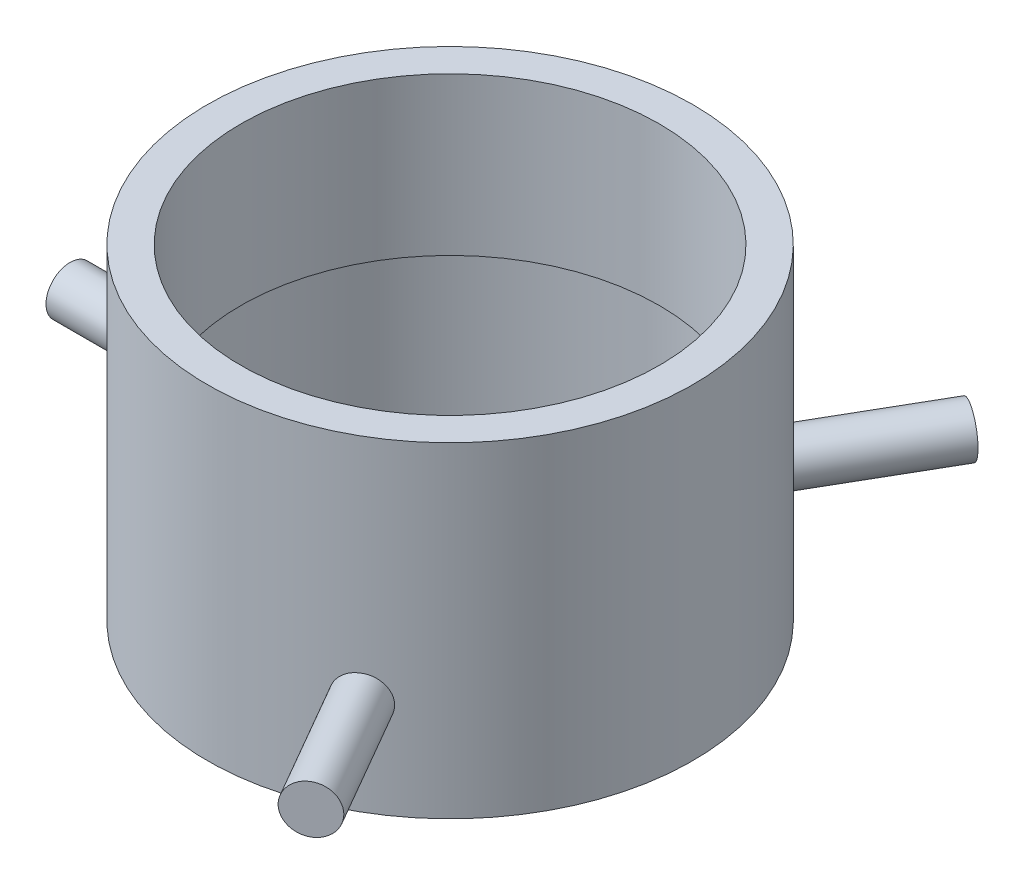
ISO-10303-21;
HEADER;
FILE_DESCRIPTION(('STEP AP214'),'2;1');
FILE_NAME('part.step','',(''),(''),'','','');
FILE_SCHEMA(('AUTOMOTIVE_DESIGN { 1 0 10303 214 1 1 1 1 }'));
ENDSEC;
DATA;
#1=APPLICATION_CONTEXT('core data for automotive mechanical design processes');
#2=APPLICATION_PROTOCOL_DEFINITION('international standard','automotive_design',2000,#1);
#3=PRODUCT_CONTEXT('',#1,'mechanical');
#4=PRODUCT('Part','Part','',(#3));
#5=PRODUCT_RELATED_PRODUCT_CATEGORY('part','',(#4));
#6=PRODUCT_DEFINITION_FORMATION('','',#4);
#7=PRODUCT_DEFINITION_CONTEXT('part definition',#1,'design');
#8=PRODUCT_DEFINITION('design','',#6,#7);
#9=PRODUCT_DEFINITION_SHAPE('','',#8);
#10=(LENGTH_UNIT() NAMED_UNIT(*) SI_UNIT(.MILLI.,.METRE.));
#11=(NAMED_UNIT(*) PLANE_ANGLE_UNIT() SI_UNIT($,.RADIAN.));
#12=(NAMED_UNIT(*) SI_UNIT($,.STERADIAN.) SOLID_ANGLE_UNIT());
#13=UNCERTAINTY_MEASURE_WITH_UNIT(LENGTH_MEASURE(1.E-05),#10,'distance_accuracy_value','');
#14=(GEOMETRIC_REPRESENTATION_CONTEXT(3) GLOBAL_UNCERTAINTY_ASSIGNED_CONTEXT((#13)) GLOBAL_UNIT_ASSIGNED_CONTEXT((#10,
#11,#12)) REPRESENTATION_CONTEXT('',''));
#15=CARTESIAN_POINT('',(0.,0.,0.));
#16=DIRECTION('',(0.,0.,1.));
#17=DIRECTION('',(1.,0.,0.));
#18=AXIS2_PLACEMENT_3D('',#15,#16,#17);
#19=CARTESIAN_POINT('',(50.1649999999992,-12.7,86.8883287616932));
#20=DIRECTION('',(-0.499999999999992,0.,-0.866025403784443));
#21=DIRECTION('',(-0.866025403784443,0.,0.499999999999992));
#22=AXIS2_PLACEMENT_3D('',#19,#20,#21);
#23=PLANE('',#22);
#24=CARTESIAN_POINT('',(50.1649999999992,-19.05,86.8883287616932));
#25=DIRECTION('',(0.499999999999992,0.,0.866025403784443));
#26=DIRECTION('',(0.866025403784443,0.,-0.499999999999992));
#27=AXIS2_PLACEMENT_3D('',#24,#25,#26);
#28=CIRCLE('',#27,6.35);
#29=CARTESIAN_POINT('',(55.6642613140304,-19.05,83.7133287616933));
#30=VERTEX_POINT('',#29);
#31=EDGE_CURVE('E45',#30,#30,#28,.T.);
#32=ORIENTED_EDGE('',*,*,#31,.T.);
#33=EDGE_LOOP('',(#32));
#34=FACE_BOUND('',#33,.T.);
#35=ADVANCED_FACE('F39',(#34),#23,.F.);
#36=CARTESIAN_POINT('',(29.6548737553863,-12.7,51.3637480363711));
#37=DIRECTION('',(0.499999999999992,0.,0.866025403784443));
#38=DIRECTION('',(0.866025403784443,0.,-0.499999999999992));
#39=AXIS2_PLACEMENT_3D('',#36,#37,#38);
#40=PLANE('',#39);
#41=CARTESIAN_POINT('',(29.6548737553863,-19.05,51.363748036371));
#42=DIRECTION('',(0.499999999999992,0.,0.866025403784443));
#43=DIRECTION('',(0.866025403784443,0.,-0.499999999999992));
#44=AXIS2_PLACEMENT_3D('',#41,#42,#43);
#45=CIRCLE('',#44,6.35);
#46=CARTESIAN_POINT('',(35.1541350694175,-19.05,48.1887480363711));
#47=VERTEX_POINT('',#46);
#48=EDGE_CURVE('E11',#47,#47,#45,.T.);
#49=ORIENTED_EDGE('',*,*,#48,.F.);
#50=EDGE_LOOP('',(#49));
#51=FACE_BOUND('',#50,.T.);
#52=ADVANCED_FACE('F54',(#51),#40,.F.);
#53=CARTESIAN_POINT('',(566.022680614987,-19.05,980.38004106151));
#54=DIRECTION('',(0.499999999999992,0.,0.866025403784443));
#55=DIRECTION('',(0.866025403784443,0.,-0.499999999999992));
#56=AXIS2_PLACEMENT_3D('',#53,#54,#55);
#57=CYLINDRICAL_SURFACE('',#56,6.35);
#58=ORIENTED_EDGE('',*,*,#31,.F.);
#59=EDGE_LOOP('',(#58));
#60=FACE_BOUND('',#59,.T.);
#61=ORIENTED_EDGE('',*,*,#48,.T.);
#62=EDGE_LOOP('',(#61));
#63=FACE_BOUND('',#62,.T.);
#64=ADVANCED_FACE('F52',(#60,#63),#57,.T.);
#65=CLOSED_SHELL('',(#35,#52,#64));
#66=MANIFOLD_SOLID_BREP('B2',#65);
#67=CARTESIAN_POINT('',(50.1650000000004,-12.7,-86.8883287616925));
#68=DIRECTION('',(-0.500000000000004,0.,0.866025403784436));
#69=DIRECTION('',(0.866025403784436,0.,0.500000000000004));
#70=AXIS2_PLACEMENT_3D('',#67,#68,#69);
#71=PLANE('',#70);
#72=CARTESIAN_POINT('',(50.1650000000004,-19.05,-86.8883287616925));
#73=DIRECTION('',(0.500000000000004,0.,-0.866025403784436));
#74=DIRECTION('',(-0.866025403784436,0.,-0.500000000000004));
#75=AXIS2_PLACEMENT_3D('',#72,#73,#74);
#76=CIRCLE('',#75,6.35);
#77=CARTESIAN_POINT('',(44.6657386859693,-19.05,-90.0633287616926));
#78=VERTEX_POINT('',#77);
#79=EDGE_CURVE('E93',#78,#78,#76,.T.);
#80=ORIENTED_EDGE('',*,*,#79,.T.);
#81=EDGE_LOOP('',(#80));
#82=FACE_BOUND('',#81,.T.);
#83=ADVANCED_FACE('F87',(#82),#71,.F.);
#84=CARTESIAN_POINT('',(29.6548737553871,-12.7,-51.3637480363707));
#85=DIRECTION('',(0.500000000000004,0.,-0.866025403784436));
#86=DIRECTION('',(-0.866025403784436,0.,-0.500000000000004));
#87=AXIS2_PLACEMENT_3D('',#84,#85,#86);
#88=PLANE('',#87);
#89=CARTESIAN_POINT('',(29.654873755387,-19.05,-51.3637480363707));
#90=DIRECTION('',(0.500000000000004,0.,-0.866025403784436));
#91=DIRECTION('',(-0.866025403784436,0.,-0.500000000000004));
#92=AXIS2_PLACEMENT_3D('',#89,#90,#91);
#93=CIRCLE('',#92,6.35);
#94=CARTESIAN_POINT('',(24.1556124413558,-19.05,-54.5387480363707));
#95=VERTEX_POINT('',#94);
#96=EDGE_CURVE('E38',#95,#95,#93,.T.);
#97=ORIENTED_EDGE('',*,*,#96,.F.);
#98=EDGE_LOOP('',(#97));
#99=FACE_BOUND('',#98,.T.);
#100=ADVANCED_FACE('F102',(#99),#88,.F.);
#101=CARTESIAN_POINT('',(566.022680615001,-19.05,-980.380041061502));
#102=DIRECTION('',(0.500000000000004,0.,-0.866025403784436));
#103=DIRECTION('',(-0.866025403784436,0.,-0.500000000000004));
#104=AXIS2_PLACEMENT_3D('',#101,#102,#103);
#105=CYLINDRICAL_SURFACE('',#104,6.35);
#106=ORIENTED_EDGE('',*,*,#79,.F.);
#107=EDGE_LOOP('',(#106));
#108=FACE_BOUND('',#107,.T.);
#109=ORIENTED_EDGE('',*,*,#96,.T.);
#110=EDGE_LOOP('',(#109));
#111=FACE_BOUND('',#110,.T.);
#112=ADVANCED_FACE('F100',(#108,#111),#105,.T.);
#113=CLOSED_SHELL('',(#83,#100,#112));
#114=MANIFOLD_SOLID_BREP('B6',#113);
#115=CARTESIAN_POINT('',(-100.33,-12.7,0.));
#116=DIRECTION('',(1.,0.,0.));
#117=DIRECTION('',(0.,0.,-1.));
#118=AXIS2_PLACEMENT_3D('',#115,#116,#117);
#119=PLANE('',#118);
#120=CARTESIAN_POINT('',(-100.33,-19.05,0.));
#121=DIRECTION('',(-1.,0.,0.));
#122=DIRECTION('',(0.,0.,1.));
#123=AXIS2_PLACEMENT_3D('',#120,#121,#122);
#124=CIRCLE('',#123,6.35);
#125=CARTESIAN_POINT('',(-100.33,-19.05,6.35));
#126=VERTEX_POINT('',#125);
#127=EDGE_CURVE('E140',#126,#126,#124,.T.);
#128=ORIENTED_EDGE('',*,*,#127,.T.);
#129=EDGE_LOOP('',(#128));
#130=FACE_BOUND('',#129,.T.);
#131=ADVANCED_FACE('F134',(#130),#119,.F.);
#132=CARTESIAN_POINT('',(-59.3097475107737,-12.7,0.));
#133=DIRECTION('',(-1.,0.,0.));
#134=DIRECTION('',(0.,0.,1.));
#135=AXIS2_PLACEMENT_3D('',#132,#133,#134);
#136=PLANE('',#135);
#137=CARTESIAN_POINT('',(-59.3097475107736,-19.05,0.));
#138=DIRECTION('',(-1.,0.,0.));
#139=DIRECTION('',(0.,0.,1.));
#140=AXIS2_PLACEMENT_3D('',#137,#138,#139);
#141=CIRCLE('',#140,6.35);
#142=CARTESIAN_POINT('',(-59.3097475107736,-19.05,6.35));
#143=VERTEX_POINT('',#142);
#144=EDGE_CURVE('E86',#143,#143,#141,.T.);
#145=ORIENTED_EDGE('',*,*,#144,.F.);
#146=EDGE_LOOP('',(#145));
#147=FACE_BOUND('',#146,.T.);
#148=ADVANCED_FACE('F149',(#147),#136,.F.);
#149=CARTESIAN_POINT('',(-1132.04536122999,-19.05,0.));
#150=DIRECTION('',(-1.,0.,0.));
#151=DIRECTION('',(0.,0.,1.));
#152=AXIS2_PLACEMENT_3D('',#149,#150,#151);
#153=CYLINDRICAL_SURFACE('',#152,6.35);
#154=ORIENTED_EDGE('',*,*,#127,.F.);
#155=EDGE_LOOP('',(#154));
#156=FACE_BOUND('',#155,.T.);
#157=ORIENTED_EDGE('',*,*,#144,.T.);
#158=EDGE_LOOP('',(#157));
#159=FACE_BOUND('',#158,.T.);
#160=ADVANCED_FACE('F147',(#156,#159),#153,.T.);
#161=CLOSED_SHELL('',(#131,#148,#160));
#162=MANIFOLD_SOLID_BREP('B33',#161);
#163=CARTESIAN_POINT('',(64.0715,-44.45,0.));
#164=DIRECTION('',(0.,-1.,0.));
#165=DIRECTION('',(0.,0.,-1.));
#166=AXIS2_PLACEMENT_3D('',#163,#164,#165);
#167=PLANE('',#166);
#168=CARTESIAN_POINT('',(0.,-44.45,0.));
#169=DIRECTION('',(0.,-1.,0.));
#170=DIRECTION('',(0.,0.,-1.));
#171=AXIS2_PLACEMENT_3D('',#168,#169,#170);
#172=CIRCLE('',#171,64.0715);
#173=CARTESIAN_POINT('',(0.,-44.45,-64.0715));
#174=VERTEX_POINT('',#173);
#175=EDGE_CURVE('E196',#174,#174,#172,.T.);
#176=ORIENTED_EDGE('',*,*,#175,.T.);
#177=EDGE_LOOP('',(#176));
#178=FACE_BOUND('',#177,.T.);
#179=CARTESIAN_POINT('',(0.,-44.45,0.));
#180=DIRECTION('',(0.,-1.,0.));
#181=DIRECTION('',(0.,0.,-1.));
#182=AXIS2_PLACEMENT_3D('',#179,#180,#181);
#183=CIRCLE('',#182,57.15);
#184=CARTESIAN_POINT('',(0.,-44.45,-57.15));
#185=VERTEX_POINT('',#184);
#186=EDGE_CURVE('E133',#185,#185,#183,.T.);
#187=ORIENTED_EDGE('',*,*,#186,.F.);
#188=EDGE_LOOP('',(#187));
#189=FACE_BOUND('',#188,.T.);
#190=ADVANCED_FACE('F174',(#178,#189),#167,.T.);
#191=CARTESIAN_POINT('',(0.,-1015.25815613456,0.));
#192=DIRECTION('',(0.,-1.,0.));
#193=DIRECTION('',(0.,0.,-1.));
#194=AXIS2_PLACEMENT_3D('',#191,#192,#193);
#195=CYLINDRICAL_SURFACE('',#194,57.15);
#196=ORIENTED_EDGE('',*,*,#186,.T.);
#197=EDGE_LOOP('',(#196));
#198=FACE_BOUND('',#197,.T.);
#199=CARTESIAN_POINT('',(0.,0.,0.));
#200=DIRECTION('',(0.,-1.,0.));
#201=DIRECTION('',(0.,0.,-1.));
#202=AXIS2_PLACEMENT_3D('',#199,#200,#201);
#203=CIRCLE('',#202,57.15);
#204=CARTESIAN_POINT('',(0.,0.,-57.15));
#205=VERTEX_POINT('',#204);
#206=EDGE_CURVE('E180',#205,#205,#203,.T.);
#207=ORIENTED_EDGE('',*,*,#206,.F.);
#208=EDGE_LOOP('',(#207));
#209=FACE_BOUND('',#208,.T.);
#210=ADVANCED_FACE('F214',(#198,#209),#195,.F.);
#211=CARTESIAN_POINT('',(57.15,0.,0.));
#212=DIRECTION('',(0.,-1.,0.));
#213=DIRECTION('',(0.,0.,-1.));
#214=AXIS2_PLACEMENT_3D('',#211,#212,#213);
#215=PLANE('',#214);
#216=ORIENTED_EDGE('',*,*,#206,.T.);
#217=EDGE_LOOP('',(#216));
#218=FACE_BOUND('',#217,.T.);
#219=CARTESIAN_POINT('',(0.,0.,0.));
#220=DIRECTION('',(0.,-1.,0.));
#221=DIRECTION('',(0.,0.,-1.));
#222=AXIS2_PLACEMENT_3D('',#219,#220,#221);
#223=CIRCLE('',#222,55.245);
#224=CARTESIAN_POINT('',(0.,0.,-55.245));
#225=VERTEX_POINT('',#224);
#226=EDGE_CURVE('E184',#225,#225,#223,.T.);
#227=ORIENTED_EDGE('',*,*,#226,.F.);
#228=EDGE_LOOP('',(#227));
#229=FACE_BOUND('',#228,.T.);
#230=ADVANCED_FACE('F218',(#218,#229),#215,.T.);
#231=CARTESIAN_POINT('',(0.,-1015.25815613456,0.));
#232=DIRECTION('',(0.,-1.,0.));
#233=DIRECTION('',(0.,0.,-1.));
#234=AXIS2_PLACEMENT_3D('',#231,#232,#233);
#235=CYLINDRICAL_SURFACE('',#234,55.245);
#236=ORIENTED_EDGE('',*,*,#226,.T.);
#237=EDGE_LOOP('',(#236));
#238=FACE_BOUND('',#237,.T.);
#239=CARTESIAN_POINT('',(0.,41.5289999999999,0.));
#240=DIRECTION('',(0.,-1.,0.));
#241=DIRECTION('',(0.,0.,-1.));
#242=AXIS2_PLACEMENT_3D('',#239,#240,#241);
#243=CIRCLE('',#242,55.245);
#244=CARTESIAN_POINT('',(0.,41.5289999999999,-55.245));
#245=VERTEX_POINT('',#244);
#246=EDGE_CURVE('E188',#245,#245,#243,.T.);
#247=ORIENTED_EDGE('',*,*,#246,.F.);
#248=EDGE_LOOP('',(#247));
#249=FACE_BOUND('',#248,.T.);
#250=ADVANCED_FACE('F210',(#238,#249),#235,.F.);
#251=CARTESIAN_POINT('',(55.245,41.529,0.));
#252=DIRECTION('',(0.,1.,0.));
#253=DIRECTION('',(0.,0.,1.));
#254=AXIS2_PLACEMENT_3D('',#251,#252,#253);
#255=PLANE('',#254);
#256=ORIENTED_EDGE('',*,*,#246,.T.);
#257=EDGE_LOOP('',(#256));
#258=FACE_BOUND('',#257,.T.);
#259=CARTESIAN_POINT('',(0.,41.5289999999999,0.));
#260=DIRECTION('',(0.,-1.,0.));
#261=DIRECTION('',(0.,0.,-1.));
#262=AXIS2_PLACEMENT_3D('',#259,#260,#261);
#263=CIRCLE('',#262,64.0715);
#264=CARTESIAN_POINT('',(0.,41.5289999999999,-64.0715));
#265=VERTEX_POINT('',#264);
#266=EDGE_CURVE('E193',#265,#265,#263,.T.);
#267=ORIENTED_EDGE('',*,*,#266,.F.);
#268=EDGE_LOOP('',(#267));
#269=FACE_BOUND('',#268,.T.);
#270=ADVANCED_FACE('F204',(#258,#269),#255,.T.);
#271=CARTESIAN_POINT('',(0.,-1015.25815613456,0.));
#272=DIRECTION('',(0.,-1.,0.));
#273=DIRECTION('',(0.,0.,-1.));
#274=AXIS2_PLACEMENT_3D('',#271,#272,#273);
#275=CYLINDRICAL_SURFACE('',#274,64.0715);
#276=ORIENTED_EDGE('',*,*,#266,.T.);
#277=EDGE_LOOP('',(#276));
#278=FACE_BOUND('',#277,.T.);
#279=ORIENTED_EDGE('',*,*,#175,.F.);
#280=EDGE_LOOP('',(#279));
#281=FACE_BOUND('',#280,.T.);
#282=ADVANCED_FACE('F202',(#278,#281),#275,.T.);
#283=CLOSED_SHELL('',(#190,#210,#230,#250,#270,#282));
#284=MANIFOLD_SOLID_BREP('B81',#283);
#285=ADVANCED_BREP_SHAPE_REPRESENTATION('',(#18,#66,#114,#162,#284),#14);
#286=SHAPE_DEFINITION_REPRESENTATION(#9,#285);
ENDSEC;
END-ISO-10303-21;
